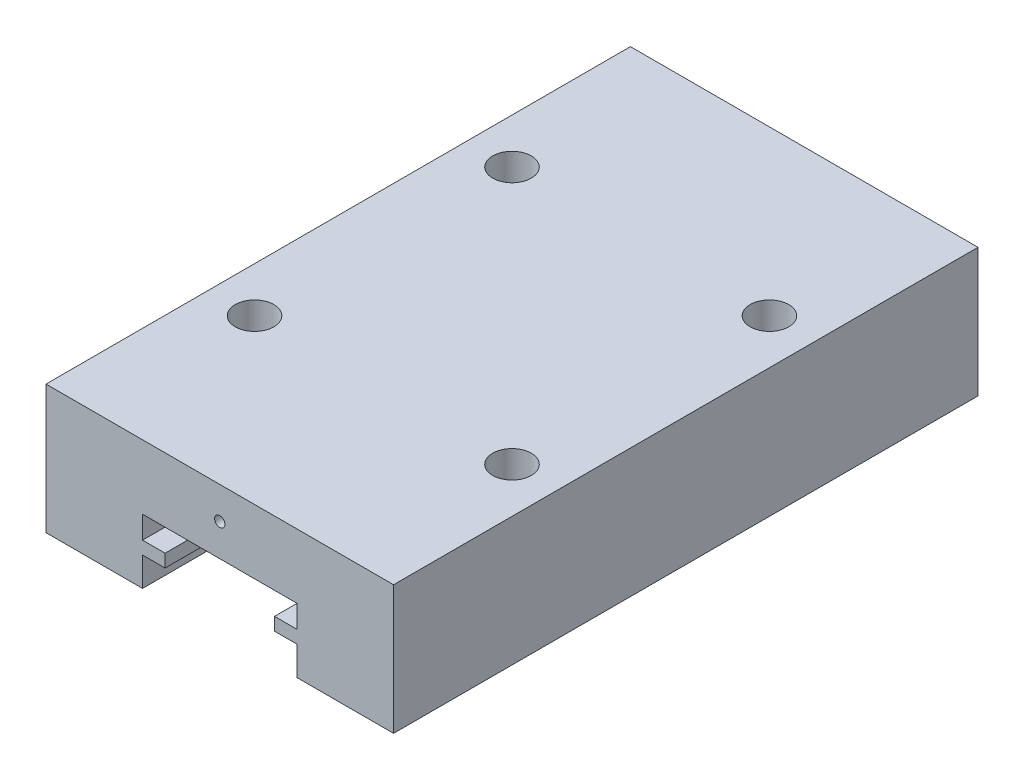
ISO-10303-21;
HEADER;
FILE_DESCRIPTION(('STEP AP214'),'2;1');
FILE_NAME('part.step','',(''),(''),'','','');
FILE_SCHEMA(('AUTOMOTIVE_DESIGN { 1 0 10303 214 1 1 1 1 }'));
ENDSEC;
DATA;
#1=APPLICATION_CONTEXT('core data for automotive mechanical design processes');
#2=APPLICATION_PROTOCOL_DEFINITION('international standard','automotive_design',2000,#1);
#3=PRODUCT_CONTEXT('',#1,'mechanical');
#4=PRODUCT('Part','Part','',(#3));
#5=PRODUCT_RELATED_PRODUCT_CATEGORY('part','',(#4));
#6=PRODUCT_DEFINITION_FORMATION('','',#4);
#7=PRODUCT_DEFINITION_CONTEXT('part definition',#1,'design');
#8=PRODUCT_DEFINITION('design','',#6,#7);
#9=PRODUCT_DEFINITION_SHAPE('','',#8);
#10=(LENGTH_UNIT() NAMED_UNIT(*) SI_UNIT(.MILLI.,.METRE.));
#11=(NAMED_UNIT(*) PLANE_ANGLE_UNIT() SI_UNIT($,.RADIAN.));
#12=(NAMED_UNIT(*) SI_UNIT($,.STERADIAN.) SOLID_ANGLE_UNIT());
#13=UNCERTAINTY_MEASURE_WITH_UNIT(LENGTH_MEASURE(1.E-05),#10,'distance_accuracy_value','');
#14=(GEOMETRIC_REPRESENTATION_CONTEXT(3) GLOBAL_UNCERTAINTY_ASSIGNED_CONTEXT((#13)) GLOBAL_UNIT_ASSIGNED_CONTEXT((#10,
#11,#12)) REPRESENTATION_CONTEXT('',''));
#15=CARTESIAN_POINT('',(0.,0.,0.));
#16=DIRECTION('',(0.,0.,1.));
#17=DIRECTION('',(1.,0.,0.));
#18=AXIS2_PLACEMENT_3D('',#15,#16,#17);
#19=CARTESIAN_POINT('',(0.,0.,45.4));
#20=DIRECTION('',(1.,0.,0.));
#21=DIRECTION('',(0.,0.,-1.));
#22=AXIS2_PLACEMENT_3D('',#19,#20,#21);
#23=PLANE('',#22);
#24=DIRECTION('',(0.,-1.,0.));
#25=VECTOR('',#24,1.);
#26=CARTESIAN_POINT('',(0.,0.,0.));
#27=LINE('',#26,#25);
#28=CARTESIAN_POINT('',(0.,10.,0.));
#29=VERTEX_POINT('',#28);
#30=CARTESIAN_POINT('',(0.,0.,0.));
#31=VERTEX_POINT('',#30);
#32=EDGE_CURVE('E190',#29,#31,#27,.T.);
#33=ORIENTED_EDGE('',*,*,#32,.T.);
#34=DIRECTION('',(0.,0.,-1.));
#35=VECTOR('',#34,1.);
#36=CARTESIAN_POINT('',(0.,0.,45.4));
#37=LINE('',#36,#35);
#38=CARTESIAN_POINT('',(0.,0.,45.4));
#39=VERTEX_POINT('',#38);
#40=EDGE_CURVE('E11',#39,#31,#37,.T.);
#41=ORIENTED_EDGE('',*,*,#40,.F.);
#42=DIRECTION('',(0.,-1.,0.));
#43=VECTOR('',#42,1.);
#44=CARTESIAN_POINT('',(0.,0.,45.4));
#45=LINE('',#44,#43);
#46=CARTESIAN_POINT('',(0.,10.,45.4));
#47=VERTEX_POINT('',#46);
#48=EDGE_CURVE('E237',#47,#39,#45,.T.);
#49=ORIENTED_EDGE('',*,*,#48,.F.);
#50=DIRECTION('',(0.,0.,-1.));
#51=VECTOR('',#50,1.);
#52=CARTESIAN_POINT('',(0.,10.,45.4));
#53=LINE('',#52,#51);
#54=EDGE_CURVE('E186',#47,#29,#53,.T.);
#55=ORIENTED_EDGE('',*,*,#54,.T.);
#56=EDGE_LOOP('',(#33,#41,#49,#55));
#57=FACE_BOUND('',#56,.T.);
#58=ADVANCED_FACE('F38',(#57),#23,.F.);
#59=CARTESIAN_POINT('',(0.,0.,45.4));
#60=DIRECTION('',(0.,1.,0.));
#61=DIRECTION('',(0.,0.,1.));
#62=AXIS2_PLACEMENT_3D('',#59,#60,#61);
#63=PLANE('',#62);
#64=DIRECTION('',(1.,0.,0.));
#65=VECTOR('',#64,1.);
#66=CARTESIAN_POINT('',(0.,0.,0.));
#67=LINE('',#66,#65);
#68=CARTESIAN_POINT('',(7.5,0.,0.));
#69=VERTEX_POINT('',#68);
#70=EDGE_CURVE('E194',#31,#69,#67,.T.);
#71=ORIENTED_EDGE('',*,*,#70,.T.);
#72=DIRECTION('',(0.,0.,-1.));
#73=VECTOR('',#72,1.);
#74=CARTESIAN_POINT('',(7.5,0.,45.4));
#75=LINE('',#74,#73);
#76=CARTESIAN_POINT('',(7.5,0.,45.4));
#77=VERTEX_POINT('',#76);
#78=EDGE_CURVE('E47',#77,#69,#75,.T.);
#79=ORIENTED_EDGE('',*,*,#78,.F.);
#80=DIRECTION('',(1.,0.,0.));
#81=VECTOR('',#80,1.);
#82=CARTESIAN_POINT('',(0.,0.,45.4));
#83=LINE('',#82,#81);
#84=EDGE_CURVE('E123',#39,#77,#83,.T.);
#85=ORIENTED_EDGE('',*,*,#84,.F.);
#86=ORIENTED_EDGE('',*,*,#40,.T.);
#87=EDGE_LOOP('',(#71,#79,#85,#86));
#88=FACE_BOUND('',#87,.T.);
#89=ADVANCED_FACE('F365',(#88),#63,.F.);
#90=CARTESIAN_POINT('',(7.5,0.,45.4));
#91=DIRECTION('',(-1.,0.,0.));
#92=DIRECTION('',(0.,0.,1.));
#93=AXIS2_PLACEMENT_3D('',#90,#91,#92);
#94=PLANE('',#93);
#95=DIRECTION('',(0.,1.,0.));
#96=VECTOR('',#95,1.);
#97=CARTESIAN_POINT('',(7.5,0.,0.));
#98=LINE('',#97,#96);
#99=CARTESIAN_POINT('',(7.5,2.24788275599384,0.));
#100=VERTEX_POINT('',#99);
#101=EDGE_CURVE('E198',#69,#100,#98,.T.);
#102=ORIENTED_EDGE('',*,*,#101,.T.);
#103=DIRECTION('',(0.,0.,-1.));
#104=VECTOR('',#103,1.);
#105=CARTESIAN_POINT('',(7.5,2.24788275599384,45.4));
#106=LINE('',#105,#104);
#107=CARTESIAN_POINT('',(7.5,2.24788275599384,45.4));
#108=VERTEX_POINT('',#107);
#109=EDGE_CURVE('E280',#108,#100,#106,.T.);
#110=ORIENTED_EDGE('',*,*,#109,.F.);
#111=DIRECTION('',(0.,1.,0.));
#112=VECTOR('',#111,1.);
#113=CARTESIAN_POINT('',(7.5,0.,45.4));
#114=LINE('',#113,#112);
#115=EDGE_CURVE('E290',#77,#108,#114,.T.);
#116=ORIENTED_EDGE('',*,*,#115,.F.);
#117=ORIENTED_EDGE('',*,*,#78,.T.);
#118=EDGE_LOOP('',(#102,#110,#116,#117));
#119=FACE_BOUND('',#118,.T.);
#120=ADVANCED_FACE('F288',(#119),#94,.F.);
#121=CARTESIAN_POINT('',(7.5,2.24788275599384,45.4));
#122=DIRECTION('',(0.,1.,0.));
#123=DIRECTION('',(0.,0.,1.));
#124=AXIS2_PLACEMENT_3D('',#121,#122,#123);
#125=PLANE('',#124);
#126=DIRECTION('',(1.,0.,0.));
#127=VECTOR('',#126,1.);
#128=CARTESIAN_POINT('',(7.5,2.24788275599384,0.));
#129=LINE('',#128,#127);
#130=CARTESIAN_POINT('',(9.25,2.24788275599384,0.));
#131=VERTEX_POINT('',#130);
#132=EDGE_CURVE('E201',#100,#131,#129,.T.);
#133=ORIENTED_EDGE('',*,*,#132,.T.);
#134=DIRECTION('',(0.,0.,-1.));
#135=VECTOR('',#134,1.);
#136=CARTESIAN_POINT('',(9.25,2.24788275599384,45.4));
#137=LINE('',#136,#135);
#138=CARTESIAN_POINT('',(9.25,2.24788275599384,45.4));
#139=VERTEX_POINT('',#138);
#140=EDGE_CURVE('E276',#139,#131,#137,.T.);
#141=ORIENTED_EDGE('',*,*,#140,.F.);
#142=DIRECTION('',(1.,0.,0.));
#143=VECTOR('',#142,1.);
#144=CARTESIAN_POINT('',(7.5,2.24788275599384,45.4));
#145=LINE('',#144,#143);
#146=EDGE_CURVE('E309',#108,#139,#145,.T.);
#147=ORIENTED_EDGE('',*,*,#146,.F.);
#148=ORIENTED_EDGE('',*,*,#109,.T.);
#149=EDGE_LOOP('',(#133,#141,#147,#148));
#150=FACE_BOUND('',#149,.T.);
#151=ADVANCED_FACE('F299',(#150),#125,.F.);
#152=CARTESIAN_POINT('',(9.25,2.24788275599384,45.4));
#153=DIRECTION('',(-1.,0.,0.));
#154=DIRECTION('',(0.,0.,1.));
#155=AXIS2_PLACEMENT_3D('',#152,#153,#154);
#156=PLANE('',#155);
#157=DIRECTION('',(0.,1.,0.));
#158=VECTOR('',#157,1.);
#159=CARTESIAN_POINT('',(9.25,2.24788275599384,0.));
#160=LINE('',#159,#158);
#161=CARTESIAN_POINT('',(9.25,3.24788275599384,0.));
#162=VERTEX_POINT('',#161);
#163=EDGE_CURVE('E204',#131,#162,#160,.T.);
#164=ORIENTED_EDGE('',*,*,#163,.T.);
#165=DIRECTION('',(0.,0.,-1.));
#166=VECTOR('',#165,1.);
#167=CARTESIAN_POINT('',(9.25,3.24788275599384,45.4));
#168=LINE('',#167,#166);
#169=CARTESIAN_POINT('',(9.25,3.24788275599384,45.4));
#170=VERTEX_POINT('',#169);
#171=EDGE_CURVE('E272',#170,#162,#168,.T.);
#172=ORIENTED_EDGE('',*,*,#171,.F.);
#173=DIRECTION('',(0.,1.,0.));
#174=VECTOR('',#173,1.);
#175=CARTESIAN_POINT('',(9.25,2.24788275599384,45.4));
#176=LINE('',#175,#174);
#177=EDGE_CURVE('E305',#139,#170,#176,.T.);
#178=ORIENTED_EDGE('',*,*,#177,.F.);
#179=ORIENTED_EDGE('',*,*,#140,.T.);
#180=EDGE_LOOP('',(#164,#172,#178,#179));
#181=FACE_BOUND('',#180,.T.);
#182=ADVANCED_FACE('F303',(#181),#156,.F.);
#183=CARTESIAN_POINT('',(9.25,3.24788275599384,45.4));
#184=DIRECTION('',(0.,-1.,0.));
#185=DIRECTION('',(0.,0.,-1.));
#186=AXIS2_PLACEMENT_3D('',#183,#184,#185);
#187=PLANE('',#186);
#188=DIRECTION('',(-1.,0.,0.));
#189=VECTOR('',#188,1.);
#190=CARTESIAN_POINT('',(9.25,3.24788275599384,0.));
#191=LINE('',#190,#189);
#192=CARTESIAN_POINT('',(7.5,3.24788275599384,0.));
#193=VERTEX_POINT('',#192);
#194=EDGE_CURVE('E207',#162,#193,#191,.T.);
#195=ORIENTED_EDGE('',*,*,#194,.T.);
#196=DIRECTION('',(0.,0.,-1.));
#197=VECTOR('',#196,1.);
#198=CARTESIAN_POINT('',(7.5,3.24788275599384,45.4));
#199=LINE('',#198,#197);
#200=CARTESIAN_POINT('',(7.5,3.24788275599384,45.4));
#201=VERTEX_POINT('',#200);
#202=EDGE_CURVE('E268',#201,#193,#199,.T.);
#203=ORIENTED_EDGE('',*,*,#202,.F.);
#204=DIRECTION('',(-1.,0.,0.));
#205=VECTOR('',#204,1.);
#206=CARTESIAN_POINT('',(9.25,3.24788275599384,45.4));
#207=LINE('',#206,#205);
#208=EDGE_CURVE('E308',#170,#201,#207,.T.);
#209=ORIENTED_EDGE('',*,*,#208,.F.);
#210=ORIENTED_EDGE('',*,*,#171,.T.);
#211=EDGE_LOOP('',(#195,#203,#209,#210));
#212=FACE_BOUND('',#211,.T.);
#213=ADVANCED_FACE('F378',(#212),#187,.F.);
#214=CARTESIAN_POINT('',(7.5,3.24788275599384,45.4));
#215=DIRECTION('',(-1.,0.,0.));
#216=DIRECTION('',(0.,-1.,0.));
#217=AXIS2_PLACEMENT_3D('',#214,#215,#216);
#218=PLANE('',#217);
#219=DIRECTION('',(0.,1.,0.));
#220=VECTOR('',#219,1.);
#221=CARTESIAN_POINT('',(7.5,3.24788275599384,0.));
#222=LINE('',#221,#220);
#223=CARTESIAN_POINT('',(7.5,4.99788275599384,0.));
#224=VERTEX_POINT('',#223);
#225=EDGE_CURVE('E210',#193,#224,#222,.T.);
#226=ORIENTED_EDGE('',*,*,#225,.T.);
#227=DIRECTION('',(0.,0.,-1.));
#228=VECTOR('',#227,1.);
#229=CARTESIAN_POINT('',(7.5,4.99788275599384,45.4));
#230=LINE('',#229,#228);
#231=CARTESIAN_POINT('',(7.5,4.99788275599384,45.4));
#232=VERTEX_POINT('',#231);
#233=EDGE_CURVE('E264',#232,#224,#230,.T.);
#234=ORIENTED_EDGE('',*,*,#233,.F.);
#235=DIRECTION('',(0.,1.,0.));
#236=VECTOR('',#235,1.);
#237=CARTESIAN_POINT('',(7.5,3.24788275599384,45.4));
#238=LINE('',#237,#236);
#239=EDGE_CURVE('E313',#201,#232,#238,.T.);
#240=ORIENTED_EDGE('',*,*,#239,.F.);
#241=ORIENTED_EDGE('',*,*,#202,.T.);
#242=EDGE_LOOP('',(#226,#234,#240,#241));
#243=FACE_BOUND('',#242,.T.);
#244=ADVANCED_FACE('F381',(#243),#218,.F.);
#245=CARTESIAN_POINT('',(7.5,4.99788275599384,45.4));
#246=DIRECTION('',(0.,1.,0.));
#247=DIRECTION('',(0.,0.,1.));
#248=AXIS2_PLACEMENT_3D('',#245,#246,#247);
#249=PLANE('',#248);
#250=DIRECTION('',(1.,0.,0.));
#251=VECTOR('',#250,1.);
#252=CARTESIAN_POINT('',(7.5,4.99788275599384,0.));
#253=LINE('',#252,#251);
#254=CARTESIAN_POINT('',(19.5,4.99788275599384,0.));
#255=VERTEX_POINT('',#254);
#256=EDGE_CURVE('E213',#224,#255,#253,.T.);
#257=ORIENTED_EDGE('',*,*,#256,.T.);
#258=DIRECTION('',(0.,0.,-1.));
#259=VECTOR('',#258,1.);
#260=CARTESIAN_POINT('',(19.5,4.99788275599384,45.4));
#261=LINE('',#260,#259);
#262=CARTESIAN_POINT('',(19.5,4.99788275599384,45.4));
#263=VERTEX_POINT('',#262);
#264=EDGE_CURVE('E260',#263,#255,#261,.T.);
#265=ORIENTED_EDGE('',*,*,#264,.F.);
#266=DIRECTION('',(1.,0.,0.));
#267=VECTOR('',#266,1.);
#268=CARTESIAN_POINT('',(7.5,4.99788275599384,45.4));
#269=LINE('',#268,#267);
#270=EDGE_CURVE('E320',#232,#263,#269,.T.);
#271=ORIENTED_EDGE('',*,*,#270,.F.);
#272=ORIENTED_EDGE('',*,*,#233,.T.);
#273=EDGE_LOOP('',(#257,#265,#271,#272));
#274=FACE_BOUND('',#273,.T.);
#275=ADVANCED_FACE('F385',(#274),#249,.F.);
#276=CARTESIAN_POINT('',(19.5,4.99788275599384,45.4));
#277=DIRECTION('',(1.,0.,0.));
#278=DIRECTION('',(0.,0.,-1.));
#279=AXIS2_PLACEMENT_3D('',#276,#277,#278);
#280=PLANE('',#279);
#281=DIRECTION('',(0.,-1.,0.));
#282=VECTOR('',#281,1.);
#283=CARTESIAN_POINT('',(19.5,4.99788275599384,0.));
#284=LINE('',#283,#282);
#285=CARTESIAN_POINT('',(19.5,3.24788275599384,0.));
#286=VERTEX_POINT('',#285);
#287=EDGE_CURVE('E216',#255,#286,#284,.T.);
#288=ORIENTED_EDGE('',*,*,#287,.T.);
#289=DIRECTION('',(0.,0.,-1.));
#290=VECTOR('',#289,1.);
#291=CARTESIAN_POINT('',(19.5,3.24788275599384,45.4));
#292=LINE('',#291,#290);
#293=CARTESIAN_POINT('',(19.5,3.24788275599384,45.4));
#294=VERTEX_POINT('',#293);
#295=EDGE_CURVE('E256',#294,#286,#292,.T.);
#296=ORIENTED_EDGE('',*,*,#295,.F.);
#297=DIRECTION('',(0.,-1.,0.));
#298=VECTOR('',#297,1.);
#299=CARTESIAN_POINT('',(19.5,4.99788275599384,45.4));
#300=LINE('',#299,#298);
#301=EDGE_CURVE('E323',#263,#294,#300,.T.);
#302=ORIENTED_EDGE('',*,*,#301,.F.);
#303=ORIENTED_EDGE('',*,*,#264,.T.);
#304=EDGE_LOOP('',(#288,#296,#302,#303));
#305=FACE_BOUND('',#304,.T.);
#306=ADVANCED_FACE('F389',(#305),#280,.F.);
#307=CARTESIAN_POINT('',(19.5,3.24788275599384,45.4));
#308=DIRECTION('',(0.,-1.,0.));
#309=DIRECTION('',(0.,0.,-1.));
#310=AXIS2_PLACEMENT_3D('',#307,#308,#309);
#311=PLANE('',#310);
#312=DIRECTION('',(-1.,0.,0.));
#313=VECTOR('',#312,1.);
#314=CARTESIAN_POINT('',(19.5,3.24788275599384,0.));
#315=LINE('',#314,#313);
#316=CARTESIAN_POINT('',(17.75,3.24788275599384,0.));
#317=VERTEX_POINT('',#316);
#318=EDGE_CURVE('E219',#286,#317,#315,.T.);
#319=ORIENTED_EDGE('',*,*,#318,.T.);
#320=DIRECTION('',(0.,0.,-1.));
#321=VECTOR('',#320,1.);
#322=CARTESIAN_POINT('',(17.75,3.24788275599384,45.4));
#323=LINE('',#322,#321);
#324=CARTESIAN_POINT('',(17.75,3.24788275599384,45.4));
#325=VERTEX_POINT('',#324);
#326=EDGE_CURVE('E252',#325,#317,#323,.T.);
#327=ORIENTED_EDGE('',*,*,#326,.F.);
#328=DIRECTION('',(-1.,0.,0.));
#329=VECTOR('',#328,1.);
#330=CARTESIAN_POINT('',(19.5,3.24788275599384,45.4));
#331=LINE('',#330,#329);
#332=EDGE_CURVE('E326',#294,#325,#331,.T.);
#333=ORIENTED_EDGE('',*,*,#332,.F.);
#334=ORIENTED_EDGE('',*,*,#295,.T.);
#335=EDGE_LOOP('',(#319,#327,#333,#334));
#336=FACE_BOUND('',#335,.T.);
#337=ADVANCED_FACE('F393',(#336),#311,.F.);
#338=CARTESIAN_POINT('',(17.75,3.24788275599384,45.4));
#339=DIRECTION('',(1.,0.,0.));
#340=DIRECTION('',(0.,0.,-1.));
#341=AXIS2_PLACEMENT_3D('',#338,#339,#340);
#342=PLANE('',#341);
#343=DIRECTION('',(0.,-1.,0.));
#344=VECTOR('',#343,1.);
#345=CARTESIAN_POINT('',(17.75,3.24788275599384,0.));
#346=LINE('',#345,#344);
#347=CARTESIAN_POINT('',(17.75,2.24788275599384,0.));
#348=VERTEX_POINT('',#347);
#349=EDGE_CURVE('E222',#317,#348,#346,.T.);
#350=ORIENTED_EDGE('',*,*,#349,.T.);
#351=DIRECTION('',(0.,0.,-1.));
#352=VECTOR('',#351,1.);
#353=CARTESIAN_POINT('',(17.75,2.24788275599384,45.4));
#354=LINE('',#353,#352);
#355=CARTESIAN_POINT('',(17.75,2.24788275599384,45.4));
#356=VERTEX_POINT('',#355);
#357=EDGE_CURVE('E248',#356,#348,#354,.T.);
#358=ORIENTED_EDGE('',*,*,#357,.F.);
#359=DIRECTION('',(0.,-1.,0.));
#360=VECTOR('',#359,1.);
#361=CARTESIAN_POINT('',(17.75,3.24788275599384,45.4));
#362=LINE('',#361,#360);
#363=EDGE_CURVE('E329',#325,#356,#362,.T.);
#364=ORIENTED_EDGE('',*,*,#363,.F.);
#365=ORIENTED_EDGE('',*,*,#326,.T.);
#366=EDGE_LOOP('',(#350,#358,#364,#365));
#367=FACE_BOUND('',#366,.T.);
#368=ADVANCED_FACE('F397',(#367),#342,.F.);
#369=CARTESIAN_POINT('',(17.75,2.24788275599384,45.4));
#370=DIRECTION('',(0.,1.,0.));
#371=DIRECTION('',(0.,0.,1.));
#372=AXIS2_PLACEMENT_3D('',#369,#370,#371);
#373=PLANE('',#372);
#374=DIRECTION('',(1.,0.,0.));
#375=VECTOR('',#374,1.);
#376=CARTESIAN_POINT('',(17.75,2.24788275599384,0.));
#377=LINE('',#376,#375);
#378=CARTESIAN_POINT('',(19.5,2.24788275599384,0.));
#379=VERTEX_POINT('',#378);
#380=EDGE_CURVE('E225',#348,#379,#377,.T.);
#381=ORIENTED_EDGE('',*,*,#380,.T.);
#382=DIRECTION('',(0.,0.,-1.));
#383=VECTOR('',#382,1.);
#384=CARTESIAN_POINT('',(19.5,2.24788275599384,45.4));
#385=LINE('',#384,#383);
#386=CARTESIAN_POINT('',(19.5,2.24788275599384,45.4));
#387=VERTEX_POINT('',#386);
#388=EDGE_CURVE('E244',#387,#379,#385,.T.);
#389=ORIENTED_EDGE('',*,*,#388,.F.);
#390=DIRECTION('',(1.,0.,0.));
#391=VECTOR('',#390,1.);
#392=CARTESIAN_POINT('',(17.75,2.24788275599384,45.4));
#393=LINE('',#392,#391);
#394=EDGE_CURVE('E332',#356,#387,#393,.T.);
#395=ORIENTED_EDGE('',*,*,#394,.F.);
#396=ORIENTED_EDGE('',*,*,#357,.T.);
#397=EDGE_LOOP('',(#381,#389,#395,#396));
#398=FACE_BOUND('',#397,.T.);
#399=ADVANCED_FACE('F340',(#398),#373,.F.);
#400=CARTESIAN_POINT('',(19.5,2.24788275599384,45.4));
#401=DIRECTION('',(1.,0.,0.));
#402=DIRECTION('',(0.,0.,-1.));
#403=AXIS2_PLACEMENT_3D('',#400,#401,#402);
#404=PLANE('',#403);
#405=DIRECTION('',(0.,-1.,0.));
#406=VECTOR('',#405,1.);
#407=CARTESIAN_POINT('',(19.5,2.24788275599384,0.));
#408=LINE('',#407,#406);
#409=CARTESIAN_POINT('',(19.5,0.,0.));
#410=VERTEX_POINT('',#409);
#411=EDGE_CURVE('E228',#379,#410,#408,.T.);
#412=ORIENTED_EDGE('',*,*,#411,.T.);
#413=DIRECTION('',(0.,0.,-1.));
#414=VECTOR('',#413,1.);
#415=CARTESIAN_POINT('',(19.5,0.,45.4));
#416=LINE('',#415,#414);
#417=CARTESIAN_POINT('',(19.5,0.,45.4));
#418=VERTEX_POINT('',#417);
#419=EDGE_CURVE('E179',#418,#410,#416,.T.);
#420=ORIENTED_EDGE('',*,*,#419,.F.);
#421=DIRECTION('',(0.,-1.,0.));
#422=VECTOR('',#421,1.);
#423=CARTESIAN_POINT('',(19.5,2.24788275599384,45.4));
#424=LINE('',#423,#422);
#425=EDGE_CURVE('E168',#387,#418,#424,.T.);
#426=ORIENTED_EDGE('',*,*,#425,.F.);
#427=ORIENTED_EDGE('',*,*,#388,.T.);
#428=EDGE_LOOP('',(#412,#420,#426,#427));
#429=FACE_BOUND('',#428,.T.);
#430=ADVANCED_FACE('F344',(#429),#404,.F.);
#431=CARTESIAN_POINT('',(19.5,0.,45.4));
#432=DIRECTION('',(0.,1.,0.));
#433=DIRECTION('',(0.,0.,1.));
#434=AXIS2_PLACEMENT_3D('',#431,#432,#433);
#435=PLANE('',#434);
#436=DIRECTION('',(1.,0.,0.));
#437=VECTOR('',#436,1.);
#438=CARTESIAN_POINT('',(19.5,0.,0.));
#439=LINE('',#438,#437);
#440=CARTESIAN_POINT('',(27.,0.,0.));
#441=VERTEX_POINT('',#440);
#442=EDGE_CURVE('E177',#410,#441,#439,.T.);
#443=ORIENTED_EDGE('',*,*,#442,.T.);
#444=DIRECTION('',(0.,0.,-1.));
#445=VECTOR('',#444,1.);
#446=CARTESIAN_POINT('',(27.,0.,45.4));
#447=LINE('',#446,#445);
#448=CARTESIAN_POINT('',(27.,0.,45.4));
#449=VERTEX_POINT('',#448);
#450=EDGE_CURVE('E174',#449,#441,#447,.T.);
#451=ORIENTED_EDGE('',*,*,#450,.F.);
#452=DIRECTION('',(1.,0.,0.));
#453=VECTOR('',#452,1.);
#454=CARTESIAN_POINT('',(19.5,0.,45.4));
#455=LINE('',#454,#453);
#456=EDGE_CURVE('E162',#418,#449,#455,.T.);
#457=ORIENTED_EDGE('',*,*,#456,.F.);
#458=ORIENTED_EDGE('',*,*,#419,.T.);
#459=EDGE_LOOP('',(#443,#451,#457,#458));
#460=FACE_BOUND('',#459,.T.);
#461=ADVANCED_FACE('F175',(#460),#435,.F.);
#462=CARTESIAN_POINT('',(27.,0.,45.4));
#463=DIRECTION('',(-1.,0.,0.));
#464=DIRECTION('',(0.,0.,1.));
#465=AXIS2_PLACEMENT_3D('',#462,#463,#464);
#466=PLANE('',#465);
#467=DIRECTION('',(0.,1.,0.));
#468=VECTOR('',#467,1.);
#469=CARTESIAN_POINT('',(27.,0.,0.));
#470=LINE('',#469,#468);
#471=CARTESIAN_POINT('',(27.,10.,0.));
#472=VERTEX_POINT('',#471);
#473=EDGE_CURVE('E109',#441,#472,#470,.T.);
#474=ORIENTED_EDGE('',*,*,#473,.T.);
#475=DIRECTION('',(0.,0.,-1.));
#476=VECTOR('',#475,1.);
#477=CARTESIAN_POINT('',(27.,10.,45.4));
#478=LINE('',#477,#476);
#479=CARTESIAN_POINT('',(27.,10.,45.4));
#480=VERTEX_POINT('',#479);
#481=EDGE_CURVE('E180',#480,#472,#478,.T.);
#482=ORIENTED_EDGE('',*,*,#481,.F.);
#483=DIRECTION('',(0.,1.,0.));
#484=VECTOR('',#483,1.);
#485=CARTESIAN_POINT('',(27.,0.,45.4));
#486=LINE('',#485,#484);
#487=EDGE_CURVE('E166',#449,#480,#486,.T.);
#488=ORIENTED_EDGE('',*,*,#487,.F.);
#489=ORIENTED_EDGE('',*,*,#450,.T.);
#490=EDGE_LOOP('',(#474,#482,#488,#489));
#491=FACE_BOUND('',#490,.T.);
#492=ADVANCED_FACE('F182',(#491),#466,.F.);
#493=CARTESIAN_POINT('',(0.,10.,45.4));
#494=DIRECTION('',(0.,-1.,0.));
#495=DIRECTION('',(0.,0.,-1.));
#496=AXIS2_PLACEMENT_3D('',#493,#494,#495);
#497=PLANE('',#496);
#498=CARTESIAN_POINT('',(3.5,10.,32.7));
#499=DIRECTION('',(0.,1.,0.));
#500=DIRECTION('',(0.,0.,1.));
#501=AXIS2_PLACEMENT_3D('',#498,#499,#500);
#502=CIRCLE('',#501,1.5);
#503=CARTESIAN_POINT('',(3.5,10.,34.2));
#504=VERTEX_POINT('',#503);
#505=EDGE_CURVE('E558',#504,#504,#502,.T.);
#506=ORIENTED_EDGE('',*,*,#505,.F.);
#507=EDGE_LOOP('',(#506));
#508=FACE_BOUND('',#507,.T.);
#509=CARTESIAN_POINT('',(23.5,10.,32.7));
#510=DIRECTION('',(0.,1.,0.));
#511=DIRECTION('',(0.,0.,1.));
#512=AXIS2_PLACEMENT_3D('',#509,#510,#511);
#513=CIRCLE('',#512,1.5);
#514=CARTESIAN_POINT('',(23.5,10.,34.2));
#515=VERTEX_POINT('',#514);
#516=EDGE_CURVE('E562',#515,#515,#513,.T.);
#517=ORIENTED_EDGE('',*,*,#516,.F.);
#518=EDGE_LOOP('',(#517));
#519=FACE_BOUND('',#518,.T.);
#520=CARTESIAN_POINT('',(23.4999999999999,10.,12.7));
#521=DIRECTION('',(0.,1.,0.));
#522=DIRECTION('',(0.,0.,1.));
#523=AXIS2_PLACEMENT_3D('',#520,#521,#522);
#524=CIRCLE('',#523,1.5);
#525=CARTESIAN_POINT('',(23.4999999999999,10.,14.2));
#526=VERTEX_POINT('',#525);
#527=EDGE_CURVE('E572',#526,#526,#524,.T.);
#528=ORIENTED_EDGE('',*,*,#527,.F.);
#529=EDGE_LOOP('',(#528));
#530=FACE_BOUND('',#529,.T.);
#531=CARTESIAN_POINT('',(3.49999999999993,10.,12.7));
#532=DIRECTION('',(0.,1.,0.));
#533=DIRECTION('',(0.,0.,1.));
#534=AXIS2_PLACEMENT_3D('',#531,#532,#533);
#535=CIRCLE('',#534,1.5);
#536=CARTESIAN_POINT('',(3.49999999999993,10.,14.2));
#537=VERTEX_POINT('',#536);
#538=EDGE_CURVE('E580',#537,#537,#535,.T.);
#539=ORIENTED_EDGE('',*,*,#538,.F.);
#540=EDGE_LOOP('',(#539));
#541=FACE_BOUND('',#540,.T.);
#542=DIRECTION('',(-1.,0.,0.));
#543=VECTOR('',#542,1.);
#544=CARTESIAN_POINT('',(0.,10.,0.));
#545=LINE('',#544,#543);
#546=EDGE_CURVE('E115',#472,#29,#545,.T.);
#547=ORIENTED_EDGE('',*,*,#546,.T.);
#548=ORIENTED_EDGE('',*,*,#54,.F.);
#549=DIRECTION('',(-1.,0.,0.));
#550=VECTOR('',#549,1.);
#551=CARTESIAN_POINT('',(0.,10.,45.4));
#552=LINE('',#551,#550);
#553=EDGE_CURVE('E55',#480,#47,#552,.T.);
#554=ORIENTED_EDGE('',*,*,#553,.F.);
#555=ORIENTED_EDGE('',*,*,#481,.T.);
#556=EDGE_LOOP('',(#547,#548,#554,#555));
#557=FACE_BOUND('',#556,.T.);
#558=ADVANCED_FACE('F348',(#508,#519,#530,#541,#557),#497,.F.);
#559=CARTESIAN_POINT('',(0.,0.,45.4));
#560=DIRECTION('',(0.,0.,-1.));
#561=DIRECTION('',(-1.,0.,0.));
#562=AXIS2_PLACEMENT_3D('',#559,#560,#561);
#563=PLANE('',#562);
#564=CARTESIAN_POINT('',(13.5,7.5,45.4));
#565=DIRECTION('',(0.,0.,1.));
#566=DIRECTION('',(1.,0.,0.));
#567=AXIS2_PLACEMENT_3D('',#564,#565,#566);
#568=CIRCLE('',#567,0.399999999999999);
#569=CARTESIAN_POINT('',(13.9,7.5,45.4));
#570=VERTEX_POINT('',#569);
#571=EDGE_CURVE('E596',#570,#570,#568,.T.);
#572=ORIENTED_EDGE('',*,*,#571,.F.);
#573=EDGE_LOOP('',(#572));
#574=FACE_BOUND('',#573,.T.);
#575=ORIENTED_EDGE('',*,*,#48,.T.);
#576=ORIENTED_EDGE('',*,*,#84,.T.);
#577=ORIENTED_EDGE('',*,*,#115,.T.);
#578=ORIENTED_EDGE('',*,*,#146,.T.);
#579=ORIENTED_EDGE('',*,*,#177,.T.);
#580=ORIENTED_EDGE('',*,*,#208,.T.);
#581=ORIENTED_EDGE('',*,*,#239,.T.);
#582=ORIENTED_EDGE('',*,*,#270,.T.);
#583=ORIENTED_EDGE('',*,*,#301,.T.);
#584=ORIENTED_EDGE('',*,*,#332,.T.);
#585=ORIENTED_EDGE('',*,*,#363,.T.);
#586=ORIENTED_EDGE('',*,*,#394,.T.);
#587=ORIENTED_EDGE('',*,*,#425,.T.);
#588=ORIENTED_EDGE('',*,*,#456,.T.);
#589=ORIENTED_EDGE('',*,*,#487,.T.);
#590=ORIENTED_EDGE('',*,*,#553,.T.);
#591=EDGE_LOOP('',(#575,#576,#577,#578,#579,#580,#581,#582,#583,#584,#585,#586,#587,#588,#589,#590));
#592=FACE_BOUND('',#591,.T.);
#593=ADVANCED_FACE('F164',(#574,#592),#563,.F.);
#594=CARTESIAN_POINT('',(0.,0.,0.));
#595=DIRECTION('',(0.,0.,-1.));
#596=DIRECTION('',(-1.,0.,0.));
#597=AXIS2_PLACEMENT_3D('',#594,#595,#596);
#598=PLANE('',#597);
#599=CARTESIAN_POINT('',(13.5,7.5,0.));
#600=DIRECTION('',(0.,0.,-1.));
#601=DIRECTION('',(-1.,0.,0.));
#602=AXIS2_PLACEMENT_3D('',#599,#600,#601);
#603=CIRCLE('',#602,0.399999999999989);
#604=CARTESIAN_POINT('',(13.1,7.5,0.));
#605=VERTEX_POINT('',#604);
#606=EDGE_CURVE('E588',#605,#605,#603,.T.);
#607=ORIENTED_EDGE('',*,*,#606,.F.);
#608=EDGE_LOOP('',(#607));
#609=FACE_BOUND('',#608,.T.);
#610=ORIENTED_EDGE('',*,*,#32,.F.);
#611=ORIENTED_EDGE('',*,*,#546,.F.);
#612=ORIENTED_EDGE('',*,*,#473,.F.);
#613=ORIENTED_EDGE('',*,*,#442,.F.);
#614=ORIENTED_EDGE('',*,*,#411,.F.);
#615=ORIENTED_EDGE('',*,*,#380,.F.);
#616=ORIENTED_EDGE('',*,*,#349,.F.);
#617=ORIENTED_EDGE('',*,*,#318,.F.);
#618=ORIENTED_EDGE('',*,*,#287,.F.);
#619=ORIENTED_EDGE('',*,*,#256,.F.);
#620=ORIENTED_EDGE('',*,*,#225,.F.);
#621=ORIENTED_EDGE('',*,*,#194,.F.);
#622=ORIENTED_EDGE('',*,*,#163,.F.);
#623=ORIENTED_EDGE('',*,*,#132,.F.);
#624=ORIENTED_EDGE('',*,*,#101,.F.);
#625=ORIENTED_EDGE('',*,*,#70,.F.);
#626=EDGE_LOOP('',(#610,#611,#612,#613,#614,#615,#616,#617,#618,#619,#620,#621,#622,#623,#624,#625));
#627=FACE_BOUND('',#626,.T.);
#628=ADVANCED_FACE('F294',(#609,#627),#598,.T.);
#629=CARTESIAN_POINT('',(13.5,7.5,38.9));
#630=DIRECTION('',(0.,0.,1.));
#631=DIRECTION('',(1.,0.,0.));
#632=AXIS2_PLACEMENT_3D('',#629,#630,#631);
#633=CONICAL_SURFACE('',#632,0.399999999999998,1.02974425867665);
#634=CARTESIAN_POINT('',(13.5,7.5,38.659655752389));
#635=VERTEX_POINT('',#634);
#636=VERTEX_LOOP('',#635);
#637=FACE_BOUND('',#636,.T.);
#638=CARTESIAN_POINT('',(13.5,7.5,38.9));
#639=DIRECTION('',(0.,0.,1.));
#640=DIRECTION('',(1.,0.,0.));
#641=AXIS2_PLACEMENT_3D('',#638,#639,#640);
#642=CIRCLE('',#641,0.399999999999998);
#643=CARTESIAN_POINT('',(13.9,7.5,38.9));
#644=VERTEX_POINT('',#643);
#645=EDGE_CURVE('E195',#644,#644,#642,.T.);
#646=ORIENTED_EDGE('',*,*,#645,.T.);
#647=EDGE_LOOP('',(#646));
#648=FACE_BOUND('',#647,.T.);
#649=ADVANCED_FACE('F430',(#637,#648),#633,.F.);
#650=CARTESIAN_POINT('',(13.5,7.5,45.4));
#651=DIRECTION('',(0.,0.,1.));
#652=DIRECTION('',(1.,0.,0.));
#653=AXIS2_PLACEMENT_3D('',#650,#651,#652);
#654=CYLINDRICAL_SURFACE('',#653,0.399999999999998);
#655=ORIENTED_EDGE('',*,*,#645,.F.);
#656=EDGE_LOOP('',(#655));
#657=FACE_BOUND('',#656,.T.);
#658=ORIENTED_EDGE('',*,*,#571,.T.);
#659=EDGE_LOOP('',(#658));
#660=FACE_BOUND('',#659,.T.);
#661=ADVANCED_FACE('F438',(#657,#660),#654,.F.);
#662=CARTESIAN_POINT('',(13.5,7.5,6.50000000000001));
#663=DIRECTION('',(0.,0.,-1.));
#664=DIRECTION('',(-1.,0.,0.));
#665=AXIS2_PLACEMENT_3D('',#662,#663,#664);
#666=CONICAL_SURFACE('',#665,0.399999999999987,1.02974425867665);
#667=CARTESIAN_POINT('',(13.5,7.5,6.74034424761102));
#668=VERTEX_POINT('',#667);
#669=VERTEX_LOOP('',#668);
#670=FACE_BOUND('',#669,.T.);
#671=CARTESIAN_POINT('',(13.5,7.5,6.50000000000001));
#672=DIRECTION('',(0.,0.,-1.));
#673=DIRECTION('',(-1.,0.,0.));
#674=AXIS2_PLACEMENT_3D('',#671,#672,#673);
#675=CIRCLE('',#674,0.399999999999987);
#676=CARTESIAN_POINT('',(13.1,7.5,6.50000000000001));
#677=VERTEX_POINT('',#676);
#678=EDGE_CURVE('E592',#677,#677,#675,.T.);
#679=ORIENTED_EDGE('',*,*,#678,.T.);
#680=EDGE_LOOP('',(#679));
#681=FACE_BOUND('',#680,.T.);
#682=ADVANCED_FACE('F445',(#670,#681),#666,.F.);
#683=CARTESIAN_POINT('',(13.5,7.5,0.));
#684=DIRECTION('',(0.,0.,-1.));
#685=DIRECTION('',(-1.,0.,0.));
#686=AXIS2_PLACEMENT_3D('',#683,#684,#685);
#687=CYLINDRICAL_SURFACE('',#686,0.399999999999988);
#688=ORIENTED_EDGE('',*,*,#678,.F.);
#689=EDGE_LOOP('',(#688));
#690=FACE_BOUND('',#689,.T.);
#691=ORIENTED_EDGE('',*,*,#606,.T.);
#692=EDGE_LOOP('',(#691));
#693=FACE_BOUND('',#692,.T.);
#694=ADVANCED_FACE('F452',(#690,#693),#687,.F.);
#695=CARTESIAN_POINT('',(3.49999999999993,6.5,12.7));
#696=DIRECTION('',(0.,-1.,0.));
#697=DIRECTION('',(0.,0.,-1.));
#698=AXIS2_PLACEMENT_3D('',#695,#696,#697);
#699=PLANE('',#698);
#700=CARTESIAN_POINT('',(3.49999999999993,6.5,12.7));
#701=DIRECTION('',(0.,1.,0.));
#702=DIRECTION('',(0.,0.,1.));
#703=AXIS2_PLACEMENT_3D('',#700,#701,#702);
#704=CIRCLE('',#703,1.5);
#705=CARTESIAN_POINT('',(3.49999999999993,6.5,14.2));
#706=VERTEX_POINT('',#705);
#707=EDGE_CURVE('E584',#706,#706,#704,.T.);
#708=ORIENTED_EDGE('',*,*,#707,.T.);
#709=EDGE_LOOP('',(#708));
#710=FACE_BOUND('',#709,.T.);
#711=ADVANCED_FACE('F459',(#710),#699,.F.);
#712=CARTESIAN_POINT('',(3.49999999999993,10.,12.7));
#713=DIRECTION('',(0.,1.,0.));
#714=DIRECTION('',(0.,0.,1.));
#715=AXIS2_PLACEMENT_3D('',#712,#713,#714);
#716=CYLINDRICAL_SURFACE('',#715,1.5);
#717=ORIENTED_EDGE('',*,*,#707,.F.);
#718=EDGE_LOOP('',(#717));
#719=FACE_BOUND('',#718,.T.);
#720=ORIENTED_EDGE('',*,*,#538,.T.);
#721=EDGE_LOOP('',(#720));
#722=FACE_BOUND('',#721,.T.);
#723=ADVANCED_FACE('F466',(#719,#722),#716,.F.);
#724=CARTESIAN_POINT('',(23.4999999999999,6.5,12.7));
#725=DIRECTION('',(0.,-1.,0.));
#726=DIRECTION('',(0.,0.,-1.));
#727=AXIS2_PLACEMENT_3D('',#724,#725,#726);
#728=PLANE('',#727);
#729=CARTESIAN_POINT('',(23.4999999999999,6.5,12.7));
#730=DIRECTION('',(0.,1.,0.));
#731=DIRECTION('',(0.,0.,1.));
#732=AXIS2_PLACEMENT_3D('',#729,#730,#731);
#733=CIRCLE('',#732,1.5);
#734=CARTESIAN_POINT('',(23.4999999999999,6.5,14.2));
#735=VERTEX_POINT('',#734);
#736=EDGE_CURVE('E576',#735,#735,#733,.T.);
#737=ORIENTED_EDGE('',*,*,#736,.T.);
#738=EDGE_LOOP('',(#737));
#739=FACE_BOUND('',#738,.T.);
#740=ADVANCED_FACE('F474',(#739),#728,.F.);
#741=CARTESIAN_POINT('',(23.4999999999999,10.,12.7));
#742=DIRECTION('',(0.,1.,0.));
#743=DIRECTION('',(0.,0.,1.));
#744=AXIS2_PLACEMENT_3D('',#741,#742,#743);
#745=CYLINDRICAL_SURFACE('',#744,1.5);
#746=ORIENTED_EDGE('',*,*,#736,.F.);
#747=EDGE_LOOP('',(#746));
#748=FACE_BOUND('',#747,.T.);
#749=ORIENTED_EDGE('',*,*,#527,.T.);
#750=EDGE_LOOP('',(#749));
#751=FACE_BOUND('',#750,.T.);
#752=ADVANCED_FACE('F482',(#748,#751),#745,.F.);
#753=CARTESIAN_POINT('',(23.5,6.5,32.7));
#754=DIRECTION('',(0.,-1.,0.));
#755=DIRECTION('',(0.,0.,-1.));
#756=AXIS2_PLACEMENT_3D('',#753,#754,#755);
#757=PLANE('',#756);
#758=CARTESIAN_POINT('',(23.5,6.5,32.7));
#759=DIRECTION('',(0.,1.,0.));
#760=DIRECTION('',(0.,0.,1.));
#761=AXIS2_PLACEMENT_3D('',#758,#759,#760);
#762=CIRCLE('',#761,1.5);
#763=CARTESIAN_POINT('',(23.5,6.5,34.2));
#764=VERTEX_POINT('',#763);
#765=EDGE_CURVE('E568',#764,#764,#762,.T.);
#766=ORIENTED_EDGE('',*,*,#765,.T.);
#767=EDGE_LOOP('',(#766));
#768=FACE_BOUND('',#767,.T.);
#769=ADVANCED_FACE('F490',(#768),#757,.F.);
#770=CARTESIAN_POINT('',(23.5,10.,32.7));
#771=DIRECTION('',(0.,1.,0.));
#772=DIRECTION('',(0.,0.,1.));
#773=AXIS2_PLACEMENT_3D('',#770,#771,#772);
#774=CYLINDRICAL_SURFACE('',#773,1.5);
#775=ORIENTED_EDGE('',*,*,#765,.F.);
#776=EDGE_LOOP('',(#775));
#777=FACE_BOUND('',#776,.T.);
#778=ORIENTED_EDGE('',*,*,#516,.T.);
#779=EDGE_LOOP('',(#778));
#780=FACE_BOUND('',#779,.T.);
#781=ADVANCED_FACE('F498',(#777,#780),#774,.F.);
#782=CARTESIAN_POINT('',(3.5,6.5,32.7));
#783=DIRECTION('',(0.,-1.,0.));
#784=DIRECTION('',(0.,0.,-1.));
#785=AXIS2_PLACEMENT_3D('',#782,#783,#784);
#786=PLANE('',#785);
#787=CARTESIAN_POINT('',(3.5,6.5,32.7));
#788=DIRECTION('',(0.,1.,0.));
#789=DIRECTION('',(0.,0.,1.));
#790=AXIS2_PLACEMENT_3D('',#787,#788,#789);
#791=CIRCLE('',#790,1.5);
#792=CARTESIAN_POINT('',(3.5,6.5,34.2));
#793=VERTEX_POINT('',#792);
#794=EDGE_CURVE('E556',#793,#793,#791,.T.);
#795=ORIENTED_EDGE('',*,*,#794,.T.);
#796=EDGE_LOOP('',(#795));
#797=FACE_BOUND('',#796,.T.);
#798=ADVANCED_FACE('F506',(#797),#786,.F.);
#799=CARTESIAN_POINT('',(3.5,10.,32.7));
#800=DIRECTION('',(0.,1.,0.));
#801=DIRECTION('',(0.,0.,1.));
#802=AXIS2_PLACEMENT_3D('',#799,#800,#801);
#803=CYLINDRICAL_SURFACE('',#802,1.5);
#804=ORIENTED_EDGE('',*,*,#794,.F.);
#805=EDGE_LOOP('',(#804));
#806=FACE_BOUND('',#805,.T.);
#807=ORIENTED_EDGE('',*,*,#505,.T.);
#808=EDGE_LOOP('',(#807));
#809=FACE_BOUND('',#808,.T.);
#810=ADVANCED_FACE('F514',(#806,#809),#803,.F.);
#811=CLOSED_SHELL('',(#58,#89,#120,#151,#182,#213,#244,#275,#306,#337,#368,#399,#430,#461,#492,
#558,#593,#628,#649,#661,#682,#694,#711,#723,#740,#752,#769,#781,#798,#810));
#812=MANIFOLD_SOLID_BREP('B2',#811);
#813=ADVANCED_BREP_SHAPE_REPRESENTATION('',(#18,#812),#14);
#814=SHAPE_DEFINITION_REPRESENTATION(#9,#813);
ENDSEC;
END-ISO-10303-21;
